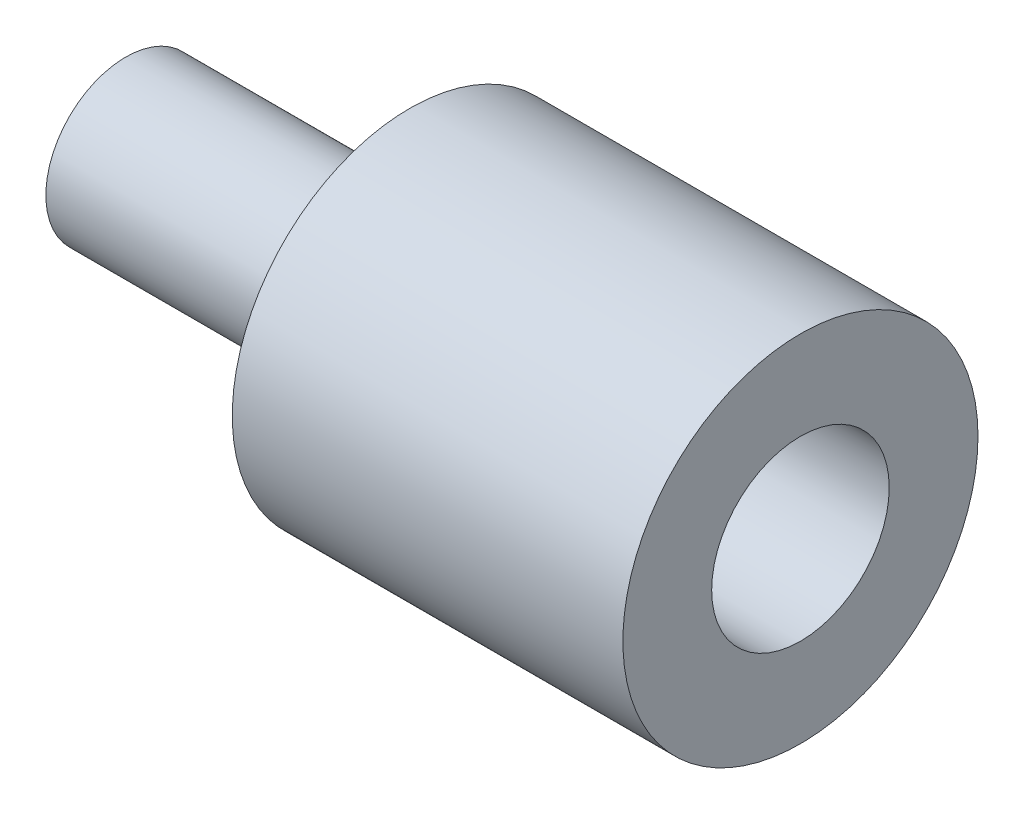
ISO-10303-21;
HEADER;
FILE_DESCRIPTION(('STEP AP214'),'2;1');
FILE_NAME('part.step','',(''),(''),'','','');
FILE_SCHEMA(('AUTOMOTIVE_DESIGN { 1 0 10303 214 1 1 1 1 }'));
ENDSEC;
DATA;
#1=APPLICATION_CONTEXT('core data for automotive mechanical design processes');
#2=APPLICATION_PROTOCOL_DEFINITION('international standard','automotive_design',2000,#1);
#3=PRODUCT_CONTEXT('',#1,'mechanical');
#4=PRODUCT('Part','Part','',(#3));
#5=PRODUCT_RELATED_PRODUCT_CATEGORY('part','',(#4));
#6=PRODUCT_DEFINITION_FORMATION('','',#4);
#7=PRODUCT_DEFINITION_CONTEXT('part definition',#1,'design');
#8=PRODUCT_DEFINITION('design','',#6,#7);
#9=PRODUCT_DEFINITION_SHAPE('','',#8);
#10=(LENGTH_UNIT() NAMED_UNIT(*) SI_UNIT(.MILLI.,.METRE.));
#11=(NAMED_UNIT(*) PLANE_ANGLE_UNIT() SI_UNIT($,.RADIAN.));
#12=(NAMED_UNIT(*) SI_UNIT($,.STERADIAN.) SOLID_ANGLE_UNIT());
#13=UNCERTAINTY_MEASURE_WITH_UNIT(LENGTH_MEASURE(1.E-05),#10,'distance_accuracy_value','');
#14=(GEOMETRIC_REPRESENTATION_CONTEXT(3) GLOBAL_UNCERTAINTY_ASSIGNED_CONTEXT((#13)) GLOBAL_UNIT_ASSIGNED_CONTEXT((#10,
#11,#12)) REPRESENTATION_CONTEXT('',''));
#15=CARTESIAN_POINT('',(0.,0.,0.));
#16=DIRECTION('',(0.,0.,1.));
#17=DIRECTION('',(1.,0.,0.));
#18=AXIS2_PLACEMENT_3D('',#15,#16,#17);
#19=CARTESIAN_POINT('',(0.,0.,0.));
#20=DIRECTION('',(-1.,0.,0.));
#21=DIRECTION('',(0.,0.,1.));
#22=AXIS2_PLACEMENT_3D('',#19,#20,#21);
#23=PLANE('',#22);
#24=CARTESIAN_POINT('',(0.,0.,0.));
#25=DIRECTION('',(1.,0.,0.));
#26=DIRECTION('',(0.,0.,-1.));
#27=AXIS2_PLACEMENT_3D('',#24,#25,#26);
#28=CIRCLE('',#27,4.5);
#29=CARTESIAN_POINT('',(0.,0.,-4.5));
#30=VERTEX_POINT('',#29);
#31=EDGE_CURVE('E10',#30,#30,#28,.T.);
#32=ORIENTED_EDGE('',*,*,#31,.F.);
#33=EDGE_LOOP('',(#32));
#34=FACE_BOUND('',#33,.T.);
#35=ADVANCED_FACE('F30',(#34),#23,.T.);
#36=CARTESIAN_POINT('',(0.,0.,0.));
#37=DIRECTION('',(1.,0.,0.));
#38=DIRECTION('',(0.,0.,-1.));
#39=AXIS2_PLACEMENT_3D('',#36,#37,#38);
#40=CYLINDRICAL_SURFACE('',#39,4.5);
#41=ORIENTED_EDGE('',*,*,#31,.T.);
#42=EDGE_LOOP('',(#41));
#43=FACE_BOUND('',#42,.T.);
#44=CARTESIAN_POINT('',(16.,0.,0.));
#45=DIRECTION('',(1.,0.,0.));
#46=DIRECTION('',(0.,0.,-1.));
#47=AXIS2_PLACEMENT_3D('',#44,#45,#46);
#48=CIRCLE('',#47,4.5);
#49=CARTESIAN_POINT('',(16.,0.,-4.5));
#50=VERTEX_POINT('',#49);
#51=EDGE_CURVE('E36',#50,#50,#48,.T.);
#52=ORIENTED_EDGE('',*,*,#51,.F.);
#53=EDGE_LOOP('',(#52));
#54=FACE_BOUND('',#53,.T.);
#55=ADVANCED_FACE('F72',(#43,#54),#40,.T.);
#56=CARTESIAN_POINT('',(16.,4.5,0.));
#57=DIRECTION('',(-1.,0.,0.));
#58=DIRECTION('',(0.,0.,1.));
#59=AXIS2_PLACEMENT_3D('',#56,#57,#58);
#60=PLANE('',#59);
#61=ORIENTED_EDGE('',*,*,#51,.T.);
#62=EDGE_LOOP('',(#61));
#63=FACE_BOUND('',#62,.T.);
#64=CARTESIAN_POINT('',(16.,0.,0.));
#65=DIRECTION('',(1.,0.,0.));
#66=DIRECTION('',(0.,0.,-1.));
#67=AXIS2_PLACEMENT_3D('',#64,#65,#66);
#68=CIRCLE('',#67,10.);
#69=CARTESIAN_POINT('',(16.,0.,-10.));
#70=VERTEX_POINT('',#69);
#71=EDGE_CURVE('E40',#70,#70,#68,.T.);
#72=ORIENTED_EDGE('',*,*,#71,.F.);
#73=EDGE_LOOP('',(#72));
#74=FACE_BOUND('',#73,.T.);
#75=ADVANCED_FACE('F77',(#63,#74),#60,.T.);
#76=CARTESIAN_POINT('',(0.,0.,0.));
#77=DIRECTION('',(1.,0.,0.));
#78=DIRECTION('',(0.,0.,-1.));
#79=AXIS2_PLACEMENT_3D('',#76,#77,#78);
#80=CYLINDRICAL_SURFACE('',#79,10.);
#81=ORIENTED_EDGE('',*,*,#71,.T.);
#82=EDGE_LOOP('',(#81));
#83=FACE_BOUND('',#82,.T.);
#84=CARTESIAN_POINT('',(38.,0.,0.));
#85=DIRECTION('',(1.,0.,0.));
#86=DIRECTION('',(0.,0.,-1.));
#87=AXIS2_PLACEMENT_3D('',#84,#85,#86);
#88=CIRCLE('',#87,10.);
#89=CARTESIAN_POINT('',(38.,0.,-10.));
#90=VERTEX_POINT('',#89);
#91=EDGE_CURVE('E44',#90,#90,#88,.T.);
#92=ORIENTED_EDGE('',*,*,#91,.F.);
#93=EDGE_LOOP('',(#92));
#94=FACE_BOUND('',#93,.T.);
#95=ADVANCED_FACE('F68',(#83,#94),#80,.T.);
#96=CARTESIAN_POINT('',(38.,10.,0.));
#97=DIRECTION('',(1.,0.,0.));
#98=DIRECTION('',(0.,0.,-1.));
#99=AXIS2_PLACEMENT_3D('',#96,#97,#98);
#100=PLANE('',#99);
#101=ORIENTED_EDGE('',*,*,#91,.T.);
#102=EDGE_LOOP('',(#101));
#103=FACE_BOUND('',#102,.T.);
#104=CARTESIAN_POINT('',(38.,0.,0.));
#105=DIRECTION('',(1.,0.,0.));
#106=DIRECTION('',(0.,0.,-1.));
#107=AXIS2_PLACEMENT_3D('',#104,#105,#106);
#108=CIRCLE('',#107,5.00000000000001);
#109=CARTESIAN_POINT('',(38.,0.,-5.00000000000001));
#110=VERTEX_POINT('',#109);
#111=EDGE_CURVE('E49',#110,#110,#108,.T.);
#112=ORIENTED_EDGE('',*,*,#111,.F.);
#113=EDGE_LOOP('',(#112));
#114=FACE_BOUND('',#113,.T.);
#115=ADVANCED_FACE('F60',(#103,#114),#100,.T.);
#116=CARTESIAN_POINT('',(0.,0.,0.));
#117=DIRECTION('',(1.,0.,0.));
#118=DIRECTION('',(0.,0.,-1.));
#119=AXIS2_PLACEMENT_3D('',#116,#117,#118);
#120=CYLINDRICAL_SURFACE('',#119,5.);
#121=ORIENTED_EDGE('',*,*,#111,.T.);
#122=EDGE_LOOP('',(#121));
#123=FACE_BOUND('',#122,.T.);
#124=CARTESIAN_POINT('',(22.,0.,0.));
#125=DIRECTION('',(1.,0.,0.));
#126=DIRECTION('',(0.,0.,-1.));
#127=AXIS2_PLACEMENT_3D('',#124,#125,#126);
#128=CIRCLE('',#127,5.);
#129=CARTESIAN_POINT('',(22.,0.,-5.));
#130=VERTEX_POINT('',#129);
#131=EDGE_CURVE('E52',#130,#130,#128,.T.);
#132=ORIENTED_EDGE('',*,*,#131,.F.);
#133=EDGE_LOOP('',(#132));
#134=FACE_BOUND('',#133,.T.);
#135=ADVANCED_FACE('F58',(#123,#134),#120,.F.);
#136=CARTESIAN_POINT('',(22.,5.,0.));
#137=DIRECTION('',(1.,0.,0.));
#138=DIRECTION('',(0.,0.,-1.));
#139=AXIS2_PLACEMENT_3D('',#136,#137,#138);
#140=PLANE('',#139);
#141=ORIENTED_EDGE('',*,*,#131,.T.);
#142=EDGE_LOOP('',(#141));
#143=FACE_BOUND('',#142,.T.);
#144=ADVANCED_FACE('F56',(#143),#140,.T.);
#145=CLOSED_SHELL('',(#35,#55,#75,#95,#115,#135,#144));
#146=MANIFOLD_SOLID_BREP('B2',#145);
#147=ADVANCED_BREP_SHAPE_REPRESENTATION('',(#18,#146),#14);
#148=SHAPE_DEFINITION_REPRESENTATION(#9,#147);
ENDSEC;
END-ISO-10303-21;
